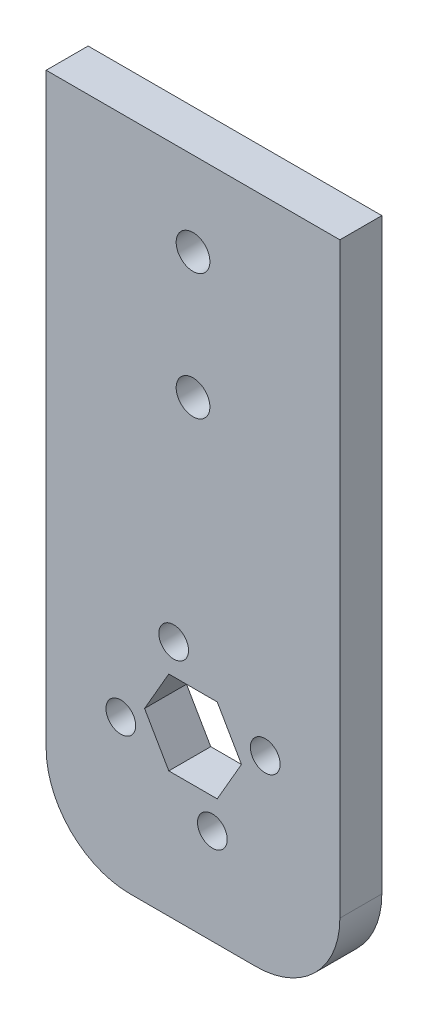
ISO-10303-21;
HEADER;
FILE_DESCRIPTION(('STEP AP214'),'2;1');
FILE_NAME('part.step','',(''),(''),'','','');
FILE_SCHEMA(('AUTOMOTIVE_DESIGN { 1 0 10303 214 1 1 1 1 }'));
ENDSEC;
DATA;
#1=APPLICATION_CONTEXT('core data for automotive mechanical design processes');
#2=APPLICATION_PROTOCOL_DEFINITION('international standard','automotive_design',2000,#1);
#3=PRODUCT_CONTEXT('',#1,'mechanical');
#4=PRODUCT('Part','Part','',(#3));
#5=PRODUCT_RELATED_PRODUCT_CATEGORY('part','',(#4));
#6=PRODUCT_DEFINITION_FORMATION('','',#4);
#7=PRODUCT_DEFINITION_CONTEXT('part definition',#1,'design');
#8=PRODUCT_DEFINITION('design','',#6,#7);
#9=PRODUCT_DEFINITION_SHAPE('','',#8);
#10=(LENGTH_UNIT() NAMED_UNIT(*) SI_UNIT(.MILLI.,.METRE.));
#11=(NAMED_UNIT(*) PLANE_ANGLE_UNIT() SI_UNIT($,.RADIAN.));
#12=(NAMED_UNIT(*) SI_UNIT($,.STERADIAN.) SOLID_ANGLE_UNIT());
#13=UNCERTAINTY_MEASURE_WITH_UNIT(LENGTH_MEASURE(1.E-05),#10,'distance_accuracy_value','');
#14=(GEOMETRIC_REPRESENTATION_CONTEXT(3) GLOBAL_UNCERTAINTY_ASSIGNED_CONTEXT((#13)) GLOBAL_UNIT_ASSIGNED_CONTEXT((#10,
#11,#12)) REPRESENTATION_CONTEXT('',''));
#15=CARTESIAN_POINT('',(0.,0.,0.));
#16=DIRECTION('',(0.,0.,1.));
#17=DIRECTION('',(1.,0.,0.));
#18=AXIS2_PLACEMENT_3D('',#15,#16,#17);
#19=CARTESIAN_POINT('',(0.,0.,0.));
#20=DIRECTION('',(0.,0.,1.));
#21=DIRECTION('',(1.,0.,0.));
#22=AXIS2_PLACEMENT_3D('',#19,#20,#21);
#23=PLANE('',#22);
#24=CARTESIAN_POINT('',(-33.1532032302755,22.4717967697245,0.));
#25=DIRECTION('',(0.,0.,-1.));
#26=DIRECTION('',(-1.,0.,0.));
#27=AXIS2_PLACEMENT_3D('',#24,#25,#26);
#28=CIRCLE('',#27,2.25);
#29=CARTESIAN_POINT('',(-35.4032032302755,22.4717967697245,0.));
#30=VERTEX_POINT('',#29);
#31=EDGE_CURVE('E473',#30,#30,#28,.T.);
#32=ORIENTED_EDGE('',*,*,#31,.F.);
#33=EDGE_LOOP('',(#32));
#34=FACE_BOUND('',#33,.T.);
#35=CARTESIAN_POINT('',(-19.2967967697245,14.4717967697245,0.));
#36=DIRECTION('',(0.,0.,-1.));
#37=DIRECTION('',(-1.,0.,0.));
#38=AXIS2_PLACEMENT_3D('',#35,#36,#37);
#39=CIRCLE('',#38,2.25);
#40=CARTESIAN_POINT('',(-21.5467967697245,14.4717967697245,0.));
#41=VERTEX_POINT('',#40);
#42=EDGE_CURVE('E478',#41,#41,#39,.T.);
#43=ORIENTED_EDGE('',*,*,#42,.F.);
#44=EDGE_LOOP('',(#43));
#45=FACE_BOUND('',#44,.T.);
#46=DIRECTION('',(1.,0.,0.));
#47=VECTOR('',#46,1.);
#48=CARTESIAN_POINT('',(-25.8911742093541,19.05,0.));
#49=LINE('',#48,#47);
#50=CARTESIAN_POINT('',(-25.8911742093541,19.05,0.));
#51=VERTEX_POINT('',#50);
#52=CARTESIAN_POINT('',(-18.5588257906459,19.05,0.));
#53=VERTEX_POINT('',#52);
#54=EDGE_CURVE('E135',#51,#53,#49,.T.);
#55=ORIENTED_EDGE('',*,*,#54,.T.);
#56=DIRECTION('',(0.499999999999999,0.866025403784439,0.));
#57=VECTOR('',#56,1.);
#58=CARTESIAN_POINT('',(-18.5588257906459,19.05,0.));
#59=LINE('',#58,#57);
#60=CARTESIAN_POINT('',(-14.8926515812918,25.4,0.));
#61=VERTEX_POINT('',#60);
#62=EDGE_CURVE('E129',#53,#61,#59,.T.);
#63=ORIENTED_EDGE('',*,*,#62,.T.);
#64=DIRECTION('',(-0.5,0.866025403784439,0.));
#65=VECTOR('',#64,1.);
#66=CARTESIAN_POINT('',(-14.8926515812918,25.4,0.));
#67=LINE('',#66,#65);
#68=CARTESIAN_POINT('',(-18.5588257906459,31.75,0.));
#69=VERTEX_POINT('',#68);
#70=EDGE_CURVE('E138',#61,#69,#67,.T.);
#71=ORIENTED_EDGE('',*,*,#70,.T.);
#72=DIRECTION('',(-1.,0.,0.));
#73=VECTOR('',#72,1.);
#74=CARTESIAN_POINT('',(-18.5588257906459,31.75,0.));
#75=LINE('',#74,#73);
#76=CARTESIAN_POINT('',(-25.8911742093541,31.75,0.));
#77=VERTEX_POINT('',#76);
#78=EDGE_CURVE('E61',#69,#77,#75,.T.);
#79=ORIENTED_EDGE('',*,*,#78,.T.);
#80=DIRECTION('',(-0.499999999999999,-0.866025403784439,0.));
#81=VECTOR('',#80,1.);
#82=CARTESIAN_POINT('',(-25.8911742093541,31.75,0.));
#83=LINE('',#82,#81);
#84=CARTESIAN_POINT('',(-29.5573484187082,25.4,0.));
#85=VERTEX_POINT('',#84);
#86=EDGE_CURVE('E155',#77,#85,#83,.T.);
#87=ORIENTED_EDGE('',*,*,#86,.T.);
#88=DIRECTION('',(0.5,-0.866025403784439,0.));
#89=VECTOR('',#88,1.);
#90=CARTESIAN_POINT('',(-29.5573484187082,25.4,0.));
#91=LINE('',#90,#89);
#92=EDGE_CURVE('E158',#85,#51,#91,.T.);
#93=ORIENTED_EDGE('',*,*,#92,.T.);
#94=EDGE_LOOP('',(#55,#63,#71,#79,#87,#93));
#95=FACE_BOUND('',#94,.T.);
#96=CARTESIAN_POINT('',(-22.225,88.9,0.));
#97=DIRECTION('',(0.,0.,-1.));
#98=DIRECTION('',(-1.,0.,0.));
#99=AXIS2_PLACEMENT_3D('',#96,#97,#98);
#100=CIRCLE('',#99,2.55269999999999);
#101=CARTESIAN_POINT('',(-24.7777,88.9,0.));
#102=VERTEX_POINT('',#101);
#103=EDGE_CURVE('E174',#102,#102,#100,.T.);
#104=ORIENTED_EDGE('',*,*,#103,.F.);
#105=EDGE_LOOP('',(#104));
#106=FACE_BOUND('',#105,.T.);
#107=CARTESIAN_POINT('',(-22.225,69.85,0.));
#108=DIRECTION('',(0.,0.,-1.));
#109=DIRECTION('',(-1.,0.,0.));
#110=AXIS2_PLACEMENT_3D('',#107,#108,#109);
#111=CIRCLE('',#110,2.55269999999999);
#112=CARTESIAN_POINT('',(-24.7777,69.85,0.));
#113=VERTEX_POINT('',#112);
#114=EDGE_CURVE('E187',#113,#113,#111,.T.);
#115=ORIENTED_EDGE('',*,*,#114,.F.);
#116=EDGE_LOOP('',(#115));
#117=FACE_BOUND('',#116,.T.);
#118=DIRECTION('',(1.,0.,0.));
#119=VECTOR('',#118,1.);
#120=CARTESIAN_POINT('',(0.,0.,0.));
#121=LINE('',#120,#119);
#122=CARTESIAN_POINT('',(-31.75,0.,0.));
#123=VERTEX_POINT('',#122);
#124=CARTESIAN_POINT('',(-12.7,0.,0.));
#125=VERTEX_POINT('',#124);
#126=EDGE_CURVE('E197',#123,#125,#121,.T.);
#127=ORIENTED_EDGE('',*,*,#126,.F.);
#128=CARTESIAN_POINT('',(-31.75,12.7,0.));
#129=DIRECTION('',(0.,0.,1.));
#130=DIRECTION('',(1.,0.,0.));
#131=AXIS2_PLACEMENT_3D('',#128,#129,#130);
#132=CIRCLE('',#131,12.7);
#133=CARTESIAN_POINT('',(-44.45,12.7,0.));
#134=VERTEX_POINT('',#133);
#135=EDGE_CURVE('E226',#123,#134,#132,.F.);
#136=ORIENTED_EDGE('',*,*,#135,.T.);
#137=DIRECTION('',(0.,-1.,0.));
#138=VECTOR('',#137,1.);
#139=CARTESIAN_POINT('',(-44.45,0.,0.));
#140=LINE('',#139,#138);
#141=CARTESIAN_POINT('',(-44.45,101.6,0.));
#142=VERTEX_POINT('',#141);
#143=EDGE_CURVE('E209',#142,#134,#140,.T.);
#144=ORIENTED_EDGE('',*,*,#143,.F.);
#145=DIRECTION('',(-1.,0.,0.));
#146=VECTOR('',#145,1.);
#147=CARTESIAN_POINT('',(0.,101.6,0.));
#148=LINE('',#147,#146);
#149=CARTESIAN_POINT('',(0.,101.6,0.));
#150=VERTEX_POINT('',#149);
#151=EDGE_CURVE('E207',#150,#142,#148,.T.);
#152=ORIENTED_EDGE('',*,*,#151,.F.);
#153=DIRECTION('',(0.,1.,0.));
#154=VECTOR('',#153,1.);
#155=CARTESIAN_POINT('',(0.,0.,0.));
#156=LINE('',#155,#154);
#157=CARTESIAN_POINT('',(0.,12.7,0.));
#158=VERTEX_POINT('',#157);
#159=EDGE_CURVE('E193',#158,#150,#156,.T.);
#160=ORIENTED_EDGE('',*,*,#159,.F.);
#161=CARTESIAN_POINT('',(-12.7,12.7,0.));
#162=DIRECTION('',(0.,0.,1.));
#163=DIRECTION('',(1.,0.,0.));
#164=AXIS2_PLACEMENT_3D('',#161,#162,#163);
#165=CIRCLE('',#164,12.7);
#166=EDGE_CURVE('E224',#158,#125,#165,.F.);
#167=ORIENTED_EDGE('',*,*,#166,.T.);
#168=EDGE_LOOP('',(#127,#136,#144,#152,#160,#167));
#169=FACE_BOUND('',#168,.T.);
#170=CARTESIAN_POINT('',(-25.1532032302754,36.3282032302756,0.));
#171=DIRECTION('',(0.,0.,-1.));
#172=DIRECTION('',(-1.,0.,0.));
#173=AXIS2_PLACEMENT_3D('',#170,#171,#172);
#174=CIRCLE('',#173,2.25);
#175=CARTESIAN_POINT('',(-27.4032032302754,36.3282032302756,0.));
#176=VERTEX_POINT('',#175);
#177=EDGE_CURVE('E465',#176,#176,#174,.T.);
#178=ORIENTED_EDGE('',*,*,#177,.F.);
#179=EDGE_LOOP('',(#178));
#180=FACE_BOUND('',#179,.T.);
#181=CARTESIAN_POINT('',(-11.2967967697244,28.3282032302755,0.));
#182=DIRECTION('',(0.,0.,-1.));
#183=DIRECTION('',(-1.,0.,0.));
#184=AXIS2_PLACEMENT_3D('',#181,#182,#183);
#185=CIRCLE('',#184,2.25);
#186=CARTESIAN_POINT('',(-13.5467967697244,28.3282032302755,0.));
#187=VERTEX_POINT('',#186);
#188=EDGE_CURVE('E462',#187,#187,#185,.T.);
#189=ORIENTED_EDGE('',*,*,#188,.F.);
#190=EDGE_LOOP('',(#189));
#191=FACE_BOUND('',#190,.T.);
#192=ADVANCED_FACE('F38',(#34,#45,#95,#106,#117,#169,#180,#191),#23,.F.);
#193=CARTESIAN_POINT('',(0.,0.,6.35));
#194=DIRECTION('',(0.,0.,1.));
#195=DIRECTION('',(1.,0.,0.));
#196=AXIS2_PLACEMENT_3D('',#193,#194,#195);
#197=PLANE('',#196);
#198=CARTESIAN_POINT('',(-11.2967967697244,28.3282032302755,6.35));
#199=DIRECTION('',(0.,0.,-1.));
#200=DIRECTION('',(-1.,0.,0.));
#201=AXIS2_PLACEMENT_3D('',#198,#199,#200);
#202=CIRCLE('',#201,2.25);
#203=CARTESIAN_POINT('',(-13.5467967697244,28.3282032302755,6.35));
#204=VERTEX_POINT('',#203);
#205=EDGE_CURVE('E459',#204,#204,#202,.T.);
#206=ORIENTED_EDGE('',*,*,#205,.T.);
#207=EDGE_LOOP('',(#206));
#208=FACE_BOUND('',#207,.T.);
#209=CARTESIAN_POINT('',(-33.1532032302755,22.4717967697245,6.35));
#210=DIRECTION('',(0.,0.,-1.));
#211=DIRECTION('',(-1.,0.,0.));
#212=AXIS2_PLACEMENT_3D('',#209,#210,#211);
#213=CIRCLE('',#212,2.25);
#214=CARTESIAN_POINT('',(-35.4032032302755,22.4717967697245,6.35));
#215=VERTEX_POINT('',#214);
#216=EDGE_CURVE('E476',#215,#215,#213,.T.);
#217=ORIENTED_EDGE('',*,*,#216,.T.);
#218=EDGE_LOOP('',(#217));
#219=FACE_BOUND('',#218,.T.);
#220=DIRECTION('',(0.,-1.,0.));
#221=VECTOR('',#220,1.);
#222=CARTESIAN_POINT('',(-44.45,0.,6.35));
#223=LINE('',#222,#221);
#224=CARTESIAN_POINT('',(-44.45,101.6,6.35));
#225=VERTEX_POINT('',#224);
#226=CARTESIAN_POINT('',(-44.45,12.7,6.35));
#227=VERTEX_POINT('',#226);
#228=EDGE_CURVE('E199',#225,#227,#223,.T.);
#229=ORIENTED_EDGE('',*,*,#228,.T.);
#230=CARTESIAN_POINT('',(-31.75,12.7,6.35));
#231=DIRECTION('',(0.,0.,1.));
#232=DIRECTION('',(1.,0.,0.));
#233=AXIS2_PLACEMENT_3D('',#230,#231,#232);
#234=CIRCLE('',#233,12.7);
#235=CARTESIAN_POINT('',(-31.75,0.,6.35));
#236=VERTEX_POINT('',#235);
#237=EDGE_CURVE('E46',#227,#236,#234,.T.);
#238=ORIENTED_EDGE('',*,*,#237,.T.);
#239=DIRECTION('',(1.,0.,0.));
#240=VECTOR('',#239,1.);
#241=CARTESIAN_POINT('',(0.,0.,6.35));
#242=LINE('',#241,#240);
#243=CARTESIAN_POINT('',(-12.7,0.,6.35));
#244=VERTEX_POINT('',#243);
#245=EDGE_CURVE('E202',#236,#244,#242,.T.);
#246=ORIENTED_EDGE('',*,*,#245,.T.);
#247=CARTESIAN_POINT('',(-12.7,12.7,6.35));
#248=DIRECTION('',(0.,0.,1.));
#249=DIRECTION('',(1.,0.,0.));
#250=AXIS2_PLACEMENT_3D('',#247,#248,#249);
#251=CIRCLE('',#250,12.7);
#252=CARTESIAN_POINT('',(0.,12.7,6.35));
#253=VERTEX_POINT('',#252);
#254=EDGE_CURVE('E230',#244,#253,#251,.T.);
#255=ORIENTED_EDGE('',*,*,#254,.T.);
#256=DIRECTION('',(0.,1.,0.));
#257=VECTOR('',#256,1.);
#258=CARTESIAN_POINT('',(0.,0.,6.35));
#259=LINE('',#258,#257);
#260=CARTESIAN_POINT('',(0.,101.6,6.35));
#261=VERTEX_POINT('',#260);
#262=EDGE_CURVE('E194',#253,#261,#259,.T.);
#263=ORIENTED_EDGE('',*,*,#262,.T.);
#264=DIRECTION('',(-1.,0.,0.));
#265=VECTOR('',#264,1.);
#266=CARTESIAN_POINT('',(0.,101.6,6.35));
#267=LINE('',#266,#265);
#268=EDGE_CURVE('E196',#261,#225,#267,.T.);
#269=ORIENTED_EDGE('',*,*,#268,.T.);
#270=EDGE_LOOP('',(#229,#238,#246,#255,#263,#269));
#271=FACE_BOUND('',#270,.T.);
#272=CARTESIAN_POINT('',(-22.225,69.85,6.35));
#273=DIRECTION('',(0.,0.,-1.));
#274=DIRECTION('',(-1.,0.,0.));
#275=AXIS2_PLACEMENT_3D('',#272,#273,#274);
#276=CIRCLE('',#275,2.5527);
#277=CARTESIAN_POINT('',(-24.7777,69.85,6.35));
#278=VERTEX_POINT('',#277);
#279=EDGE_CURVE('E190',#278,#278,#276,.T.);
#280=ORIENTED_EDGE('',*,*,#279,.T.);
#281=EDGE_LOOP('',(#280));
#282=FACE_BOUND('',#281,.T.);
#283=CARTESIAN_POINT('',(-22.225,88.9,6.35));
#284=DIRECTION('',(0.,0.,-1.));
#285=DIRECTION('',(-1.,0.,0.));
#286=AXIS2_PLACEMENT_3D('',#283,#284,#285);
#287=CIRCLE('',#286,2.5527);
#288=CARTESIAN_POINT('',(-24.7777,88.9,6.35));
#289=VERTEX_POINT('',#288);
#290=EDGE_CURVE('E184',#289,#289,#287,.T.);
#291=ORIENTED_EDGE('',*,*,#290,.T.);
#292=EDGE_LOOP('',(#291));
#293=FACE_BOUND('',#292,.T.);
#294=DIRECTION('',(0.499999999999999,0.866025403784439,0.));
#295=VECTOR('',#294,1.);
#296=CARTESIAN_POINT('',(-18.5588257906459,19.05,6.35));
#297=LINE('',#296,#295);
#298=CARTESIAN_POINT('',(-18.5588257906459,19.05,6.35));
#299=VERTEX_POINT('',#298);
#300=CARTESIAN_POINT('',(-14.8926515812918,25.4,6.35));
#301=VERTEX_POINT('',#300);
#302=EDGE_CURVE('E53',#299,#301,#297,.T.);
#303=ORIENTED_EDGE('',*,*,#302,.F.);
#304=DIRECTION('',(1.,0.,0.));
#305=VECTOR('',#304,1.);
#306=CARTESIAN_POINT('',(-25.8911742093541,19.05,6.35));
#307=LINE('',#306,#305);
#308=CARTESIAN_POINT('',(-25.8911742093541,19.05,6.35));
#309=VERTEX_POINT('',#308);
#310=EDGE_CURVE('E145',#309,#299,#307,.T.);
#311=ORIENTED_EDGE('',*,*,#310,.F.);
#312=DIRECTION('',(0.5,-0.866025403784439,0.));
#313=VECTOR('',#312,1.);
#314=CARTESIAN_POINT('',(-29.5573484187082,25.4,6.35));
#315=LINE('',#314,#313);
#316=CARTESIAN_POINT('',(-29.5573484187082,25.4,6.35));
#317=VERTEX_POINT('',#316);
#318=EDGE_CURVE('E148',#317,#309,#315,.T.);
#319=ORIENTED_EDGE('',*,*,#318,.F.);
#320=DIRECTION('',(-0.499999999999999,-0.866025403784439,0.));
#321=VECTOR('',#320,1.);
#322=CARTESIAN_POINT('',(-25.8911742093541,31.75,6.35));
#323=LINE('',#322,#321);
#324=CARTESIAN_POINT('',(-25.8911742093541,31.75,6.35));
#325=VERTEX_POINT('',#324);
#326=EDGE_CURVE('E167',#325,#317,#323,.T.);
#327=ORIENTED_EDGE('',*,*,#326,.F.);
#328=DIRECTION('',(-1.,0.,0.));
#329=VECTOR('',#328,1.);
#330=CARTESIAN_POINT('',(-18.5588257906459,31.75,6.35));
#331=LINE('',#330,#329);
#332=CARTESIAN_POINT('',(-18.5588257906459,31.75,6.35));
#333=VERTEX_POINT('',#332);
#334=EDGE_CURVE('E164',#333,#325,#331,.T.);
#335=ORIENTED_EDGE('',*,*,#334,.F.);
#336=DIRECTION('',(-0.5,0.866025403784439,0.));
#337=VECTOR('',#336,1.);
#338=CARTESIAN_POINT('',(-14.8926515812918,25.4,6.35));
#339=LINE('',#338,#337);
#340=EDGE_CURVE('E162',#301,#333,#339,.T.);
#341=ORIENTED_EDGE('',*,*,#340,.F.);
#342=EDGE_LOOP('',(#303,#311,#319,#327,#335,#341));
#343=FACE_BOUND('',#342,.T.);
#344=CARTESIAN_POINT('',(-19.2967967697245,14.4717967697245,6.35));
#345=DIRECTION('',(0.,0.,-1.));
#346=DIRECTION('',(-1.,0.,0.));
#347=AXIS2_PLACEMENT_3D('',#344,#345,#346);
#348=CIRCLE('',#347,2.25);
#349=CARTESIAN_POINT('',(-21.5467967697245,14.4717967697245,6.35));
#350=VERTEX_POINT('',#349);
#351=EDGE_CURVE('E151',#350,#350,#348,.T.);
#352=ORIENTED_EDGE('',*,*,#351,.T.);
#353=EDGE_LOOP('',(#352));
#354=FACE_BOUND('',#353,.T.);
#355=CARTESIAN_POINT('',(-25.1532032302754,36.3282032302756,6.35));
#356=DIRECTION('',(0.,0.,-1.));
#357=DIRECTION('',(-1.,0.,0.));
#358=AXIS2_PLACEMENT_3D('',#355,#356,#357);
#359=CIRCLE('',#358,2.25);
#360=CARTESIAN_POINT('',(-27.4032032302754,36.3282032302756,6.35));
#361=VERTEX_POINT('',#360);
#362=EDGE_CURVE('E470',#361,#361,#359,.T.);
#363=ORIENTED_EDGE('',*,*,#362,.T.);
#364=EDGE_LOOP('',(#363));
#365=FACE_BOUND('',#364,.T.);
#366=ADVANCED_FACE('F234',(#208,#219,#271,#282,#293,#343,#354,#365),#197,.T.);
#367=CARTESIAN_POINT('',(0.,0.,6.35));
#368=DIRECTION('',(-1.,0.,0.));
#369=DIRECTION('',(0.,0.,1.));
#370=AXIS2_PLACEMENT_3D('',#367,#368,#369);
#371=PLANE('',#370);
#372=ORIENTED_EDGE('',*,*,#262,.F.);
#373=DIRECTION('',(0.,0.,-1.));
#374=VECTOR('',#373,1.);
#375=CARTESIAN_POINT('',(0.,12.7,6.35));
#376=LINE('',#375,#374);
#377=EDGE_CURVE('E11',#253,#158,#376,.T.);
#378=ORIENTED_EDGE('',*,*,#377,.T.);
#379=ORIENTED_EDGE('',*,*,#159,.T.);
#380=DIRECTION('',(0.,0.,-1.));
#381=VECTOR('',#380,1.);
#382=CARTESIAN_POINT('',(0.,101.6,6.35));
#383=LINE('',#382,#381);
#384=EDGE_CURVE('E216',#261,#150,#383,.T.);
#385=ORIENTED_EDGE('',*,*,#384,.F.);
#386=EDGE_LOOP('',(#372,#378,#379,#385));
#387=FACE_BOUND('',#386,.T.);
#388=ADVANCED_FACE('F260',(#387),#371,.F.);
#389=CARTESIAN_POINT('',(0.,101.6,6.35));
#390=DIRECTION('',(0.,-1.,0.));
#391=DIRECTION('',(0.,0.,-1.));
#392=AXIS2_PLACEMENT_3D('',#389,#390,#391);
#393=PLANE('',#392);
#394=ORIENTED_EDGE('',*,*,#151,.T.);
#395=DIRECTION('',(0.,0.,-1.));
#396=VECTOR('',#395,1.);
#397=CARTESIAN_POINT('',(-44.45,101.6,6.35));
#398=LINE('',#397,#396);
#399=EDGE_CURVE('E205',#225,#142,#398,.T.);
#400=ORIENTED_EDGE('',*,*,#399,.F.);
#401=ORIENTED_EDGE('',*,*,#268,.F.);
#402=ORIENTED_EDGE('',*,*,#384,.T.);
#403=EDGE_LOOP('',(#394,#400,#401,#402));
#404=FACE_BOUND('',#403,.T.);
#405=ADVANCED_FACE('F255',(#404),#393,.F.);
#406=CARTESIAN_POINT('',(-44.45,0.,6.35));
#407=DIRECTION('',(1.,0.,0.));
#408=DIRECTION('',(0.,0.,-1.));
#409=AXIS2_PLACEMENT_3D('',#406,#407,#408);
#410=PLANE('',#409);
#411=ORIENTED_EDGE('',*,*,#143,.T.);
#412=DIRECTION('',(0.,0.,-1.));
#413=VECTOR('',#412,1.);
#414=CARTESIAN_POINT('',(-44.45,12.7,6.35));
#415=LINE('',#414,#413);
#416=EDGE_CURVE('E228',#134,#227,#415,.F.);
#417=ORIENTED_EDGE('',*,*,#416,.T.);
#418=ORIENTED_EDGE('',*,*,#228,.F.);
#419=ORIENTED_EDGE('',*,*,#399,.T.);
#420=EDGE_LOOP('',(#411,#417,#418,#419));
#421=FACE_BOUND('',#420,.T.);
#422=ADVANCED_FACE('F251',(#421),#410,.F.);
#423=CARTESIAN_POINT('',(0.,0.,6.35));
#424=DIRECTION('',(0.,1.,0.));
#425=DIRECTION('',(0.,0.,1.));
#426=AXIS2_PLACEMENT_3D('',#423,#424,#425);
#427=PLANE('',#426);
#428=ORIENTED_EDGE('',*,*,#245,.F.);
#429=DIRECTION('',(0.,0.,-1.));
#430=VECTOR('',#429,1.);
#431=CARTESIAN_POINT('',(-31.75,0.,6.35));
#432=LINE('',#431,#430);
#433=EDGE_CURVE('E221',#236,#123,#432,.T.);
#434=ORIENTED_EDGE('',*,*,#433,.T.);
#435=ORIENTED_EDGE('',*,*,#126,.T.);
#436=DIRECTION('',(0.,0.,-1.));
#437=VECTOR('',#436,1.);
#438=CARTESIAN_POINT('',(-12.7,0.,6.35));
#439=LINE('',#438,#437);
#440=EDGE_CURVE('E219',#125,#244,#439,.F.);
#441=ORIENTED_EDGE('',*,*,#440,.T.);
#442=EDGE_LOOP('',(#428,#434,#435,#441));
#443=FACE_BOUND('',#442,.T.);
#444=ADVANCED_FACE('F242',(#443),#427,.F.);
#445=CARTESIAN_POINT('',(-31.75,12.7,6.35));
#446=DIRECTION('',(0.,0.,-1.));
#447=DIRECTION('',(-1.,0.,0.));
#448=AXIS2_PLACEMENT_3D('',#445,#446,#447);
#449=CYLINDRICAL_SURFACE('',#448,12.7);
#450=ORIENTED_EDGE('',*,*,#237,.F.);
#451=ORIENTED_EDGE('',*,*,#416,.F.);
#452=ORIENTED_EDGE('',*,*,#135,.F.);
#453=ORIENTED_EDGE('',*,*,#433,.F.);
#454=EDGE_LOOP('',(#450,#451,#452,#453));
#455=FACE_BOUND('',#454,.T.);
#456=ADVANCED_FACE('F245',(#455),#449,.T.);
#457=CARTESIAN_POINT('',(-12.7,12.7,6.35));
#458=DIRECTION('',(0.,0.,-1.));
#459=DIRECTION('',(-1.,0.,0.));
#460=AXIS2_PLACEMENT_3D('',#457,#458,#459);
#461=CYLINDRICAL_SURFACE('',#460,12.7);
#462=ORIENTED_EDGE('',*,*,#254,.F.);
#463=ORIENTED_EDGE('',*,*,#440,.F.);
#464=ORIENTED_EDGE('',*,*,#166,.F.);
#465=ORIENTED_EDGE('',*,*,#377,.F.);
#466=EDGE_LOOP('',(#462,#463,#464,#465));
#467=FACE_BOUND('',#466,.T.);
#468=ADVANCED_FACE('F40',(#467),#461,.T.);
#469=CARTESIAN_POINT('',(-22.225,69.85,0.));
#470=DIRECTION('',(0.,0.,-1.));
#471=DIRECTION('',(-1.,0.,0.));
#472=AXIS2_PLACEMENT_3D('',#469,#470,#471);
#473=CYLINDRICAL_SURFACE('',#472,2.55269999999999);
#474=ORIENTED_EDGE('',*,*,#279,.F.);
#475=EDGE_LOOP('',(#474));
#476=FACE_BOUND('',#475,.T.);
#477=ORIENTED_EDGE('',*,*,#114,.T.);
#478=EDGE_LOOP('',(#477));
#479=FACE_BOUND('',#478,.T.);
#480=ADVANCED_FACE('F264',(#476,#479),#473,.F.);
#481=CARTESIAN_POINT('',(-22.225,88.9,0.));
#482=DIRECTION('',(0.,0.,-1.));
#483=DIRECTION('',(-1.,0.,0.));
#484=AXIS2_PLACEMENT_3D('',#481,#482,#483);
#485=CYLINDRICAL_SURFACE('',#484,2.55269999999999);
#486=ORIENTED_EDGE('',*,*,#290,.F.);
#487=EDGE_LOOP('',(#486));
#488=FACE_BOUND('',#487,.T.);
#489=ORIENTED_EDGE('',*,*,#103,.T.);
#490=EDGE_LOOP('',(#489));
#491=FACE_BOUND('',#490,.T.);
#492=ADVANCED_FACE('F269',(#488,#491),#485,.F.);
#493=CARTESIAN_POINT('',(-18.5588257906459,19.05,0.));
#494=DIRECTION('',(0.866025403784439,-0.499999999999999,0.));
#495=DIRECTION('',(0.5,0.866025403784439,0.));
#496=AXIS2_PLACEMENT_3D('',#493,#494,#495);
#497=PLANE('',#496);
#498=ORIENTED_EDGE('',*,*,#302,.T.);
#499=DIRECTION('',(0.,0.,1.));
#500=VECTOR('',#499,1.);
#501=CARTESIAN_POINT('',(-14.8926515812918,25.4,0.));
#502=LINE('',#501,#500);
#503=EDGE_CURVE('E125',#61,#301,#502,.T.);
#504=ORIENTED_EDGE('',*,*,#503,.F.);
#505=ORIENTED_EDGE('',*,*,#62,.F.);
#506=DIRECTION('',(0.,0.,1.));
#507=VECTOR('',#506,1.);
#508=CARTESIAN_POINT('',(-18.5588257906459,19.05,0.));
#509=LINE('',#508,#507);
#510=EDGE_CURVE('E172',#53,#299,#509,.T.);
#511=ORIENTED_EDGE('',*,*,#510,.T.);
#512=EDGE_LOOP('',(#498,#504,#505,#511));
#513=FACE_BOUND('',#512,.T.);
#514=ADVANCED_FACE('F127',(#513),#497,.F.);
#515=CARTESIAN_POINT('',(-25.8911742093541,19.05,0.));
#516=DIRECTION('',(0.,-1.,0.));
#517=DIRECTION('',(0.,0.,-1.));
#518=AXIS2_PLACEMENT_3D('',#515,#516,#517);
#519=PLANE('',#518);
#520=ORIENTED_EDGE('',*,*,#310,.T.);
#521=ORIENTED_EDGE('',*,*,#510,.F.);
#522=ORIENTED_EDGE('',*,*,#54,.F.);
#523=DIRECTION('',(0.,0.,1.));
#524=VECTOR('',#523,1.);
#525=CARTESIAN_POINT('',(-25.8911742093541,19.05,0.));
#526=LINE('',#525,#524);
#527=EDGE_CURVE('E175',#51,#309,#526,.T.);
#528=ORIENTED_EDGE('',*,*,#527,.T.);
#529=EDGE_LOOP('',(#520,#521,#522,#528));
#530=FACE_BOUND('',#529,.T.);
#531=ADVANCED_FACE('F342',(#530),#519,.F.);
#532=CARTESIAN_POINT('',(-29.5573484187082,25.4,0.));
#533=DIRECTION('',(-0.866025403784439,-0.5,0.));
#534=DIRECTION('',(0.5,-0.866025403784439,0.));
#535=AXIS2_PLACEMENT_3D('',#532,#533,#534);
#536=PLANE('',#535);
#537=ORIENTED_EDGE('',*,*,#318,.T.);
#538=ORIENTED_EDGE('',*,*,#527,.F.);
#539=ORIENTED_EDGE('',*,*,#92,.F.);
#540=DIRECTION('',(0.,0.,1.));
#541=VECTOR('',#540,1.);
#542=CARTESIAN_POINT('',(-29.5573484187082,25.4,0.));
#543=LINE('',#542,#541);
#544=EDGE_CURVE('E177',#85,#317,#543,.T.);
#545=ORIENTED_EDGE('',*,*,#544,.T.);
#546=EDGE_LOOP('',(#537,#538,#539,#545));
#547=FACE_BOUND('',#546,.T.);
#548=ADVANCED_FACE('F352',(#547),#536,.F.);
#549=CARTESIAN_POINT('',(-25.8911742093541,31.75,0.));
#550=DIRECTION('',(-0.866025403784439,0.499999999999999,0.));
#551=DIRECTION('',(-0.499999999999999,-0.866025403784439,0.));
#552=AXIS2_PLACEMENT_3D('',#549,#550,#551);
#553=PLANE('',#552);
#554=ORIENTED_EDGE('',*,*,#326,.T.);
#555=ORIENTED_EDGE('',*,*,#544,.F.);
#556=ORIENTED_EDGE('',*,*,#86,.F.);
#557=DIRECTION('',(0.,0.,1.));
#558=VECTOR('',#557,1.);
#559=CARTESIAN_POINT('',(-25.8911742093541,31.75,0.));
#560=LINE('',#559,#558);
#561=EDGE_CURVE('E179',#77,#325,#560,.T.);
#562=ORIENTED_EDGE('',*,*,#561,.T.);
#563=EDGE_LOOP('',(#554,#555,#556,#562));
#564=FACE_BOUND('',#563,.T.);
#565=ADVANCED_FACE('F363',(#564),#553,.F.);
#566=CARTESIAN_POINT('',(-18.5588257906459,31.75,0.));
#567=DIRECTION('',(0.,1.,0.));
#568=DIRECTION('',(0.,0.,1.));
#569=AXIS2_PLACEMENT_3D('',#566,#567,#568);
#570=PLANE('',#569);
#571=ORIENTED_EDGE('',*,*,#334,.T.);
#572=ORIENTED_EDGE('',*,*,#561,.F.);
#573=ORIENTED_EDGE('',*,*,#78,.F.);
#574=DIRECTION('',(0.,0.,1.));
#575=VECTOR('',#574,1.);
#576=CARTESIAN_POINT('',(-18.5588257906459,31.75,0.));
#577=LINE('',#576,#575);
#578=EDGE_CURVE('E134',#69,#333,#577,.T.);
#579=ORIENTED_EDGE('',*,*,#578,.T.);
#580=EDGE_LOOP('',(#571,#572,#573,#579));
#581=FACE_BOUND('',#580,.T.);
#582=ADVANCED_FACE('F374',(#581),#570,.F.);
#583=CARTESIAN_POINT('',(-14.8926515812918,25.4,0.));
#584=DIRECTION('',(0.866025403784439,0.5,0.));
#585=DIRECTION('',(-0.5,0.866025403784439,0.));
#586=AXIS2_PLACEMENT_3D('',#583,#584,#585);
#587=PLANE('',#586);
#588=ORIENTED_EDGE('',*,*,#340,.T.);
#589=ORIENTED_EDGE('',*,*,#578,.F.);
#590=ORIENTED_EDGE('',*,*,#70,.F.);
#591=ORIENTED_EDGE('',*,*,#503,.T.);
#592=EDGE_LOOP('',(#588,#589,#590,#591));
#593=FACE_BOUND('',#592,.T.);
#594=ADVANCED_FACE('F139',(#593),#587,.F.);
#595=CARTESIAN_POINT('',(-19.2967967697245,14.4717967697245,0.));
#596=DIRECTION('',(0.,0.,-1.));
#597=DIRECTION('',(-1.,0.,0.));
#598=AXIS2_PLACEMENT_3D('',#595,#596,#597);
#599=CYLINDRICAL_SURFACE('',#598,2.25);
#600=ORIENTED_EDGE('',*,*,#351,.F.);
#601=EDGE_LOOP('',(#600));
#602=FACE_BOUND('',#601,.T.);
#603=ORIENTED_EDGE('',*,*,#42,.T.);
#604=EDGE_LOOP('',(#603));
#605=FACE_BOUND('',#604,.T.);
#606=ADVANCED_FACE('F393',(#602,#605),#599,.F.);
#607=CARTESIAN_POINT('',(-33.1532032302755,22.4717967697245,0.));
#608=DIRECTION('',(0.,0.,-1.));
#609=DIRECTION('',(-1.,0.,0.));
#610=AXIS2_PLACEMENT_3D('',#607,#608,#609);
#611=CYLINDRICAL_SURFACE('',#610,2.25);
#612=ORIENTED_EDGE('',*,*,#216,.F.);
#613=EDGE_LOOP('',(#612));
#614=FACE_BOUND('',#613,.T.);
#615=ORIENTED_EDGE('',*,*,#31,.T.);
#616=EDGE_LOOP('',(#615));
#617=FACE_BOUND('',#616,.T.);
#618=ADVANCED_FACE('F413',(#614,#617),#611,.F.);
#619=CARTESIAN_POINT('',(-25.1532032302754,36.3282032302756,0.));
#620=DIRECTION('',(0.,0.,-1.));
#621=DIRECTION('',(-1.,0.,0.));
#622=AXIS2_PLACEMENT_3D('',#619,#620,#621);
#623=CYLINDRICAL_SURFACE('',#622,2.25);
#624=ORIENTED_EDGE('',*,*,#362,.F.);
#625=EDGE_LOOP('',(#624));
#626=FACE_BOUND('',#625,.T.);
#627=ORIENTED_EDGE('',*,*,#177,.T.);
#628=EDGE_LOOP('',(#627));
#629=FACE_BOUND('',#628,.T.);
#630=ADVANCED_FACE('F424',(#626,#629),#623,.F.);
#631=CARTESIAN_POINT('',(-11.2967967697244,28.3282032302755,0.));
#632=DIRECTION('',(0.,0.,-1.));
#633=DIRECTION('',(-1.,0.,0.));
#634=AXIS2_PLACEMENT_3D('',#631,#632,#633);
#635=CYLINDRICAL_SURFACE('',#634,2.25);
#636=ORIENTED_EDGE('',*,*,#205,.F.);
#637=EDGE_LOOP('',(#636));
#638=FACE_BOUND('',#637,.T.);
#639=ORIENTED_EDGE('',*,*,#188,.T.);
#640=EDGE_LOOP('',(#639));
#641=FACE_BOUND('',#640,.T.);
#642=ADVANCED_FACE('F435',(#638,#641),#635,.F.);
#643=CLOSED_SHELL('',(#192,#366,#388,#405,#422,#444,#456,#468,#480,#492,#514,#531,#548,#565,
#582,#594,#606,#618,#630,#642));
#644=MANIFOLD_SOLID_BREP('B2',#643);
#645=ADVANCED_BREP_SHAPE_REPRESENTATION('',(#18,#644),#14);
#646=SHAPE_DEFINITION_REPRESENTATION(#9,#645);
ENDSEC;
END-ISO-10303-21;
